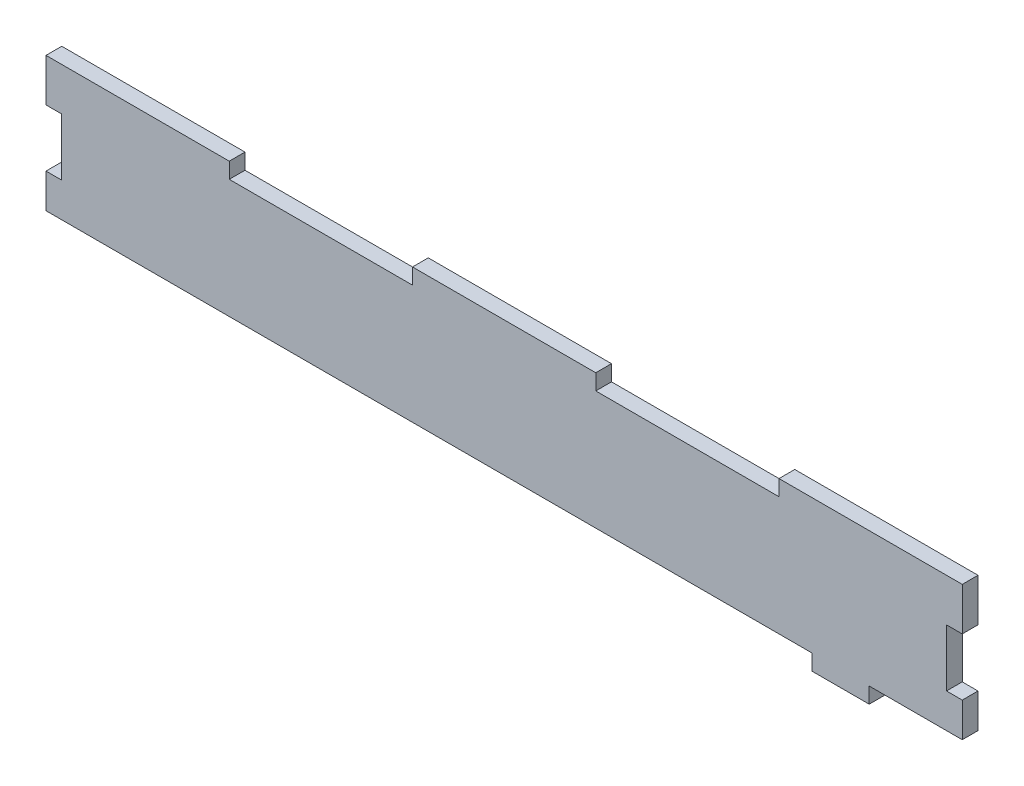
ISO-10303-21;
HEADER;
FILE_DESCRIPTION(('STEP AP214'),'2;1');
FILE_NAME('part.step','',(''),(''),'','','');
FILE_SCHEMA(('AUTOMOTIVE_DESIGN { 1 0 10303 214 1 1 1 1 }'));
ENDSEC;
DATA;
#1=APPLICATION_CONTEXT('core data for automotive mechanical design processes');
#2=APPLICATION_PROTOCOL_DEFINITION('international standard','automotive_design',2000,#1);
#3=PRODUCT_CONTEXT('',#1,'mechanical');
#4=PRODUCT('Part','Part','',(#3));
#5=PRODUCT_RELATED_PRODUCT_CATEGORY('part','',(#4));
#6=PRODUCT_DEFINITION_FORMATION('','',#4);
#7=PRODUCT_DEFINITION_CONTEXT('part definition',#1,'design');
#8=PRODUCT_DEFINITION('design','',#6,#7);
#9=PRODUCT_DEFINITION_SHAPE('','',#8);
#10=(LENGTH_UNIT() NAMED_UNIT(*) SI_UNIT(.MILLI.,.METRE.));
#11=(NAMED_UNIT(*) PLANE_ANGLE_UNIT() SI_UNIT($,.RADIAN.));
#12=(NAMED_UNIT(*) SI_UNIT($,.STERADIAN.) SOLID_ANGLE_UNIT());
#13=UNCERTAINTY_MEASURE_WITH_UNIT(LENGTH_MEASURE(1.E-05),#10,'distance_accuracy_value','');
#14=(GEOMETRIC_REPRESENTATION_CONTEXT(3) GLOBAL_UNCERTAINTY_ASSIGNED_CONTEXT((#13)) GLOBAL_UNIT_ASSIGNED_CONTEXT((#10,
#11,#12)) REPRESENTATION_CONTEXT('',''));
#15=CARTESIAN_POINT('',(0.,0.,0.));
#16=DIRECTION('',(0.,0.,1.));
#17=DIRECTION('',(1.,0.,0.));
#18=AXIS2_PLACEMENT_3D('',#15,#16,#17);
#19=CARTESIAN_POINT('',(203.723249151837,3.30834279228149,5.5));
#20=DIRECTION('',(0.,1.,0.));
#21=DIRECTION('',(-1.,0.,0.));
#22=AXIS2_PLACEMENT_3D('',#19,#20,#21);
#23=PLANE('',#22);
#24=DIRECTION('',(1.,0.,0.));
#25=VECTOR('',#24,1.);
#26=CARTESIAN_POINT('',(203.723249151837,3.30834279228149,0.));
#27=LINE('',#26,#25);
#28=CARTESIAN_POINT('',(-63.7767508481628,3.3083427922815,0.));
#29=VERTEX_POINT('',#28);
#30=CARTESIAN_POINT('',(203.723249151837,3.30834279228149,0.));
#31=VERTEX_POINT('',#30);
#32=EDGE_CURVE('E225',#29,#31,#27,.T.);
#33=ORIENTED_EDGE('',*,*,#32,.T.);
#34=DIRECTION('',(0.,0.,-1.));
#35=VECTOR('',#34,1.);
#36=CARTESIAN_POINT('',(203.723249151837,3.30834279228149,5.5));
#37=LINE('',#36,#35);
#38=CARTESIAN_POINT('',(203.723249151837,3.30834279228149,5.5));
#39=VERTEX_POINT('',#38);
#40=EDGE_CURVE('E11',#39,#31,#37,.T.);
#41=ORIENTED_EDGE('',*,*,#40,.F.);
#42=DIRECTION('',(1.,0.,0.));
#43=VECTOR('',#42,1.);
#44=CARTESIAN_POINT('',(203.723249151837,3.30834279228149,5.5));
#45=LINE('',#44,#43);
#46=CARTESIAN_POINT('',(-63.7767508481628,3.3083427922815,5.5));
#47=VERTEX_POINT('',#46);
#48=EDGE_CURVE('E271',#47,#39,#45,.T.);
#49=ORIENTED_EDGE('',*,*,#48,.F.);
#50=DIRECTION('',(0.,0.,-1.));
#51=VECTOR('',#50,1.);
#52=CARTESIAN_POINT('',(-63.7767508481628,3.3083427922815,5.5));
#53=LINE('',#52,#51);
#54=EDGE_CURVE('E221',#47,#29,#53,.T.);
#55=ORIENTED_EDGE('',*,*,#54,.T.);
#56=EDGE_LOOP('',(#33,#41,#49,#55));
#57=FACE_BOUND('',#56,.T.);
#58=ADVANCED_FACE('F33',(#57),#23,.F.);
#59=CARTESIAN_POINT('',(203.723249151837,-2.19165720771851,5.5));
#60=DIRECTION('',(1.,0.,0.));
#61=DIRECTION('',(0.,0.,-1.));
#62=AXIS2_PLACEMENT_3D('',#59,#60,#61);
#63=PLANE('',#62);
#64=DIRECTION('',(0.,-1.,0.));
#65=VECTOR('',#64,1.);
#66=CARTESIAN_POINT('',(203.723249151837,-2.19165720771851,0.));
#67=LINE('',#66,#65);
#68=CARTESIAN_POINT('',(203.723249151837,-2.19165720771851,0.));
#69=VERTEX_POINT('',#68);
#70=EDGE_CURVE('E228',#31,#69,#67,.T.);
#71=ORIENTED_EDGE('',*,*,#70,.T.);
#72=DIRECTION('',(0.,0.,-1.));
#73=VECTOR('',#72,1.);
#74=CARTESIAN_POINT('',(203.723249151837,-2.19165720771851,5.5));
#75=LINE('',#74,#73);
#76=CARTESIAN_POINT('',(203.723249151837,-2.19165720771851,5.5));
#77=VERTEX_POINT('',#76);
#78=EDGE_CURVE('E41',#77,#69,#75,.T.);
#79=ORIENTED_EDGE('',*,*,#78,.F.);
#80=DIRECTION('',(0.,-1.,0.));
#81=VECTOR('',#80,1.);
#82=CARTESIAN_POINT('',(203.723249151837,-2.19165720771851,5.5));
#83=LINE('',#82,#81);
#84=EDGE_CURVE('E140',#39,#77,#83,.T.);
#85=ORIENTED_EDGE('',*,*,#84,.F.);
#86=ORIENTED_EDGE('',*,*,#40,.T.);
#87=EDGE_LOOP('',(#71,#79,#85,#86));
#88=FACE_BOUND('',#87,.T.);
#89=ADVANCED_FACE('F409',(#88),#63,.F.);
#90=CARTESIAN_POINT('',(223.723249151837,-2.19165720771851,5.5));
#91=DIRECTION('',(0.,1.,0.));
#92=DIRECTION('',(-1.,0.,0.));
#93=AXIS2_PLACEMENT_3D('',#90,#91,#92);
#94=PLANE('',#93);
#95=DIRECTION('',(1.,0.,0.));
#96=VECTOR('',#95,1.);
#97=CARTESIAN_POINT('',(223.723249151837,-2.19165720771851,0.));
#98=LINE('',#97,#96);
#99=CARTESIAN_POINT('',(223.723249151837,-2.19165720771851,0.));
#100=VERTEX_POINT('',#99);
#101=EDGE_CURVE('E230',#69,#100,#98,.T.);
#102=ORIENTED_EDGE('',*,*,#101,.T.);
#103=DIRECTION('',(0.,0.,-1.));
#104=VECTOR('',#103,1.);
#105=CARTESIAN_POINT('',(223.723249151837,-2.19165720771851,5.5));
#106=LINE('',#105,#104);
#107=CARTESIAN_POINT('',(223.723249151837,-2.19165720771851,5.5));
#108=VERTEX_POINT('',#107);
#109=EDGE_CURVE('E326',#108,#100,#106,.T.);
#110=ORIENTED_EDGE('',*,*,#109,.F.);
#111=DIRECTION('',(1.,0.,0.));
#112=VECTOR('',#111,1.);
#113=CARTESIAN_POINT('',(223.723249151837,-2.19165720771851,5.5));
#114=LINE('',#113,#112);
#115=EDGE_CURVE('E334',#77,#108,#114,.T.);
#116=ORIENTED_EDGE('',*,*,#115,.F.);
#117=ORIENTED_EDGE('',*,*,#78,.T.);
#118=EDGE_LOOP('',(#102,#110,#116,#117));
#119=FACE_BOUND('',#118,.T.);
#120=ADVANCED_FACE('F332',(#119),#94,.F.);
#121=CARTESIAN_POINT('',(223.723249151837,3.30834279228149,5.5));
#122=DIRECTION('',(-1.,0.,0.));
#123=DIRECTION('',(0.,0.,1.));
#124=AXIS2_PLACEMENT_3D('',#121,#122,#123);
#125=PLANE('',#124);
#126=DIRECTION('',(0.,1.,0.));
#127=VECTOR('',#126,1.);
#128=CARTESIAN_POINT('',(223.723249151837,3.30834279228149,0.));
#129=LINE('',#128,#127);
#130=CARTESIAN_POINT('',(223.723249151837,3.30834279228149,0.));
#131=VERTEX_POINT('',#130);
#132=EDGE_CURVE('E232',#100,#131,#129,.T.);
#133=ORIENTED_EDGE('',*,*,#132,.T.);
#134=DIRECTION('',(0.,0.,-1.));
#135=VECTOR('',#134,1.);
#136=CARTESIAN_POINT('',(223.723249151837,3.30834279228149,5.5));
#137=LINE('',#136,#135);
#138=CARTESIAN_POINT('',(223.723249151837,3.30834279228149,5.5));
#139=VERTEX_POINT('',#138);
#140=EDGE_CURVE('E323',#139,#131,#137,.T.);
#141=ORIENTED_EDGE('',*,*,#140,.F.);
#142=DIRECTION('',(0.,1.,0.));
#143=VECTOR('',#142,1.);
#144=CARTESIAN_POINT('',(223.723249151837,3.30834279228149,5.5));
#145=LINE('',#144,#143);
#146=EDGE_CURVE('E352',#108,#139,#145,.T.);
#147=ORIENTED_EDGE('',*,*,#146,.F.);
#148=ORIENTED_EDGE('',*,*,#109,.T.);
#149=EDGE_LOOP('',(#133,#141,#147,#148));
#150=FACE_BOUND('',#149,.T.);
#151=ADVANCED_FACE('F343',(#150),#125,.F.);
#152=CARTESIAN_POINT('',(256.223249151837,3.3083427922815,5.5));
#153=DIRECTION('',(0.,1.,0.));
#154=DIRECTION('',(-1.,0.,0.));
#155=AXIS2_PLACEMENT_3D('',#152,#153,#154);
#156=PLANE('',#155);
#157=DIRECTION('',(1.,0.,0.));
#158=VECTOR('',#157,1.);
#159=CARTESIAN_POINT('',(256.223249151837,3.3083427922815,0.));
#160=LINE('',#159,#158);
#161=CARTESIAN_POINT('',(256.223249151837,3.3083427922815,0.));
#162=VERTEX_POINT('',#161);
#163=EDGE_CURVE('E234',#131,#162,#160,.T.);
#164=ORIENTED_EDGE('',*,*,#163,.T.);
#165=DIRECTION('',(0.,0.,-1.));
#166=VECTOR('',#165,1.);
#167=CARTESIAN_POINT('',(256.223249151837,3.3083427922815,5.5));
#168=LINE('',#167,#166);
#169=CARTESIAN_POINT('',(256.223249151837,3.3083427922815,5.5));
#170=VERTEX_POINT('',#169);
#171=EDGE_CURVE('E320',#170,#162,#168,.T.);
#172=ORIENTED_EDGE('',*,*,#171,.F.);
#173=DIRECTION('',(1.,0.,0.));
#174=VECTOR('',#173,1.);
#175=CARTESIAN_POINT('',(256.223249151837,3.3083427922815,5.5));
#176=LINE('',#175,#174);
#177=EDGE_CURVE('E349',#139,#170,#176,.T.);
#178=ORIENTED_EDGE('',*,*,#177,.F.);
#179=ORIENTED_EDGE('',*,*,#140,.T.);
#180=EDGE_LOOP('',(#164,#172,#178,#179));
#181=FACE_BOUND('',#180,.T.);
#182=ADVANCED_FACE('F347',(#181),#156,.F.);
#183=CARTESIAN_POINT('',(256.223249151837,15.3083427922815,5.5));
#184=DIRECTION('',(-1.,0.,0.));
#185=DIRECTION('',(0.,0.,1.));
#186=AXIS2_PLACEMENT_3D('',#183,#184,#185);
#187=PLANE('',#186);
#188=DIRECTION('',(0.,1.,0.));
#189=VECTOR('',#188,1.);
#190=CARTESIAN_POINT('',(256.223249151837,15.3083427922815,0.));
#191=LINE('',#190,#189);
#192=CARTESIAN_POINT('',(256.223249151837,15.3083427922815,0.));
#193=VERTEX_POINT('',#192);
#194=EDGE_CURVE('E236',#162,#193,#191,.T.);
#195=ORIENTED_EDGE('',*,*,#194,.T.);
#196=DIRECTION('',(0.,0.,-1.));
#197=VECTOR('',#196,1.);
#198=CARTESIAN_POINT('',(256.223249151837,15.3083427922815,5.5));
#199=LINE('',#198,#197);
#200=CARTESIAN_POINT('',(256.223249151837,15.3083427922815,5.5));
#201=VERTEX_POINT('',#200);
#202=EDGE_CURVE('E317',#201,#193,#199,.T.);
#203=ORIENTED_EDGE('',*,*,#202,.F.);
#204=DIRECTION('',(0.,1.,0.));
#205=VECTOR('',#204,1.);
#206=CARTESIAN_POINT('',(256.223249151837,15.3083427922815,5.5));
#207=LINE('',#206,#205);
#208=EDGE_CURVE('E351',#170,#201,#207,.T.);
#209=ORIENTED_EDGE('',*,*,#208,.F.);
#210=ORIENTED_EDGE('',*,*,#171,.T.);
#211=EDGE_LOOP('',(#195,#203,#209,#210));
#212=FACE_BOUND('',#211,.T.);
#213=ADVANCED_FACE('F422',(#212),#187,.F.);
#214=CARTESIAN_POINT('',(250.723249151837,15.3083427922815,5.5));
#215=DIRECTION('',(0.,-1.,0.));
#216=DIRECTION('',(0.,0.,-1.));
#217=AXIS2_PLACEMENT_3D('',#214,#215,#216);
#218=PLANE('',#217);
#219=DIRECTION('',(-1.,0.,0.));
#220=VECTOR('',#219,1.);
#221=CARTESIAN_POINT('',(250.723249151837,15.3083427922815,0.));
#222=LINE('',#221,#220);
#223=CARTESIAN_POINT('',(250.723249151837,15.3083427922815,0.));
#224=VERTEX_POINT('',#223);
#225=EDGE_CURVE('E238',#193,#224,#222,.T.);
#226=ORIENTED_EDGE('',*,*,#225,.T.);
#227=DIRECTION('',(0.,0.,-1.));
#228=VECTOR('',#227,1.);
#229=CARTESIAN_POINT('',(250.723249151837,15.3083427922815,5.5));
#230=LINE('',#229,#228);
#231=CARTESIAN_POINT('',(250.723249151837,15.3083427922815,5.5));
#232=VERTEX_POINT('',#231);
#233=EDGE_CURVE('E314',#232,#224,#230,.T.);
#234=ORIENTED_EDGE('',*,*,#233,.F.);
#235=DIRECTION('',(-1.,0.,0.));
#236=VECTOR('',#235,1.);
#237=CARTESIAN_POINT('',(250.723249151837,15.3083427922815,5.5));
#238=LINE('',#237,#236);
#239=EDGE_CURVE('E354',#201,#232,#238,.T.);
#240=ORIENTED_EDGE('',*,*,#239,.F.);
#241=ORIENTED_EDGE('',*,*,#202,.T.);
#242=EDGE_LOOP('',(#226,#234,#240,#241));
#243=FACE_BOUND('',#242,.T.);
#244=ADVANCED_FACE('F425',(#243),#218,.F.);
#245=CARTESIAN_POINT('',(250.723249151837,35.3083427922815,5.5));
#246=DIRECTION('',(-1.,0.,0.));
#247=DIRECTION('',(0.,0.,1.));
#248=AXIS2_PLACEMENT_3D('',#245,#246,#247);
#249=PLANE('',#248);
#250=DIRECTION('',(0.,1.,0.));
#251=VECTOR('',#250,1.);
#252=CARTESIAN_POINT('',(250.723249151837,35.3083427922815,0.));
#253=LINE('',#252,#251);
#254=CARTESIAN_POINT('',(250.723249151837,35.3083427922815,0.));
#255=VERTEX_POINT('',#254);
#256=EDGE_CURVE('E240',#224,#255,#253,.T.);
#257=ORIENTED_EDGE('',*,*,#256,.T.);
#258=DIRECTION('',(0.,0.,-1.));
#259=VECTOR('',#258,1.);
#260=CARTESIAN_POINT('',(250.723249151837,35.3083427922815,5.5));
#261=LINE('',#260,#259);
#262=CARTESIAN_POINT('',(250.723249151837,35.3083427922815,5.5));
#263=VERTEX_POINT('',#262);
#264=EDGE_CURVE('E311',#263,#255,#261,.T.);
#265=ORIENTED_EDGE('',*,*,#264,.F.);
#266=DIRECTION('',(0.,1.,0.));
#267=VECTOR('',#266,1.);
#268=CARTESIAN_POINT('',(250.723249151837,35.3083427922815,5.5));
#269=LINE('',#268,#267);
#270=EDGE_CURVE('E360',#232,#263,#269,.T.);
#271=ORIENTED_EDGE('',*,*,#270,.F.);
#272=ORIENTED_EDGE('',*,*,#233,.T.);
#273=EDGE_LOOP('',(#257,#265,#271,#272));
#274=FACE_BOUND('',#273,.T.);
#275=ADVANCED_FACE('F429',(#274),#249,.F.);
#276=CARTESIAN_POINT('',(256.223249151837,35.3083427922815,5.5));
#277=DIRECTION('',(0.,1.,0.));
#278=DIRECTION('',(0.,0.,1.));
#279=AXIS2_PLACEMENT_3D('',#276,#277,#278);
#280=PLANE('',#279);
#281=DIRECTION('',(1.,0.,0.));
#282=VECTOR('',#281,1.);
#283=CARTESIAN_POINT('',(256.223249151837,35.3083427922815,0.));
#284=LINE('',#283,#282);
#285=CARTESIAN_POINT('',(256.223249151837,35.3083427922815,0.));
#286=VERTEX_POINT('',#285);
#287=EDGE_CURVE('E242',#255,#286,#284,.T.);
#288=ORIENTED_EDGE('',*,*,#287,.T.);
#289=DIRECTION('',(0.,0.,-1.));
#290=VECTOR('',#289,1.);
#291=CARTESIAN_POINT('',(256.223249151837,35.3083427922815,5.5));
#292=LINE('',#291,#290);
#293=CARTESIAN_POINT('',(256.223249151837,35.3083427922815,5.5));
#294=VERTEX_POINT('',#293);
#295=EDGE_CURVE('E308',#294,#286,#292,.T.);
#296=ORIENTED_EDGE('',*,*,#295,.F.);
#297=DIRECTION('',(1.,0.,0.));
#298=VECTOR('',#297,1.);
#299=CARTESIAN_POINT('',(256.223249151837,35.3083427922815,5.5));
#300=LINE('',#299,#298);
#301=EDGE_CURVE('E362',#263,#294,#300,.T.);
#302=ORIENTED_EDGE('',*,*,#301,.F.);
#303=ORIENTED_EDGE('',*,*,#264,.T.);
#304=EDGE_LOOP('',(#288,#296,#302,#303));
#305=FACE_BOUND('',#304,.T.);
#306=ADVANCED_FACE('F433',(#305),#280,.F.);
#307=CARTESIAN_POINT('',(256.223249151837,50.3083427922815,5.5));
#308=DIRECTION('',(-1.,0.,0.));
#309=DIRECTION('',(0.,0.,1.));
#310=AXIS2_PLACEMENT_3D('',#307,#308,#309);
#311=PLANE('',#310);
#312=DIRECTION('',(0.,1.,0.));
#313=VECTOR('',#312,1.);
#314=CARTESIAN_POINT('',(256.223249151837,50.3083427922815,0.));
#315=LINE('',#314,#313);
#316=CARTESIAN_POINT('',(256.223249151837,50.3083427922815,0.));
#317=VERTEX_POINT('',#316);
#318=EDGE_CURVE('E244',#286,#317,#315,.T.);
#319=ORIENTED_EDGE('',*,*,#318,.T.);
#320=DIRECTION('',(0.,0.,-1.));
#321=VECTOR('',#320,1.);
#322=CARTESIAN_POINT('',(256.223249151837,50.3083427922815,5.5));
#323=LINE('',#322,#321);
#324=CARTESIAN_POINT('',(256.223249151837,50.3083427922815,5.5));
#325=VERTEX_POINT('',#324);
#326=EDGE_CURVE('E305',#325,#317,#323,.T.);
#327=ORIENTED_EDGE('',*,*,#326,.F.);
#328=DIRECTION('',(0.,1.,0.));
#329=VECTOR('',#328,1.);
#330=CARTESIAN_POINT('',(256.223249151837,50.3083427922815,5.5));
#331=LINE('',#330,#329);
#332=EDGE_CURVE('E364',#294,#325,#331,.T.);
#333=ORIENTED_EDGE('',*,*,#332,.F.);
#334=ORIENTED_EDGE('',*,*,#295,.T.);
#335=EDGE_LOOP('',(#319,#327,#333,#334));
#336=FACE_BOUND('',#335,.T.);
#337=ADVANCED_FACE('F437',(#336),#311,.F.);
#338=CARTESIAN_POINT('',(192.223249151837,50.3083427922815,5.5));
#339=DIRECTION('',(0.,-1.,0.));
#340=DIRECTION('',(0.,0.,-1.));
#341=AXIS2_PLACEMENT_3D('',#338,#339,#340);
#342=PLANE('',#341);
#343=DIRECTION('',(-1.,0.,0.));
#344=VECTOR('',#343,1.);
#345=CARTESIAN_POINT('',(192.223249151837,50.3083427922815,0.));
#346=LINE('',#345,#344);
#347=CARTESIAN_POINT('',(192.223249151837,50.3083427922815,0.));
#348=VERTEX_POINT('',#347);
#349=EDGE_CURVE('E246',#317,#348,#346,.T.);
#350=ORIENTED_EDGE('',*,*,#349,.T.);
#351=DIRECTION('',(0.,0.,-1.));
#352=VECTOR('',#351,1.);
#353=CARTESIAN_POINT('',(192.223249151837,50.3083427922815,5.5));
#354=LINE('',#353,#352);
#355=CARTESIAN_POINT('',(192.223249151837,50.3083427922815,5.5));
#356=VERTEX_POINT('',#355);
#357=EDGE_CURVE('E302',#356,#348,#354,.T.);
#358=ORIENTED_EDGE('',*,*,#357,.F.);
#359=DIRECTION('',(-1.,0.,0.));
#360=VECTOR('',#359,1.);
#361=CARTESIAN_POINT('',(192.223249151837,50.3083427922815,5.5));
#362=LINE('',#361,#360);
#363=EDGE_CURVE('E366',#325,#356,#362,.T.);
#364=ORIENTED_EDGE('',*,*,#363,.F.);
#365=ORIENTED_EDGE('',*,*,#326,.T.);
#366=EDGE_LOOP('',(#350,#358,#364,#365));
#367=FACE_BOUND('',#366,.T.);
#368=ADVANCED_FACE('F441',(#367),#342,.F.);
#369=CARTESIAN_POINT('',(192.223249151837,44.8083427922815,5.5));
#370=DIRECTION('',(1.,0.,0.));
#371=DIRECTION('',(0.,0.,-1.));
#372=AXIS2_PLACEMENT_3D('',#369,#370,#371);
#373=PLANE('',#372);
#374=DIRECTION('',(0.,-1.,0.));
#375=VECTOR('',#374,1.);
#376=CARTESIAN_POINT('',(192.223249151837,44.8083427922815,0.));
#377=LINE('',#376,#375);
#378=CARTESIAN_POINT('',(192.223249151837,44.8083427922815,0.));
#379=VERTEX_POINT('',#378);
#380=EDGE_CURVE('E248',#348,#379,#377,.T.);
#381=ORIENTED_EDGE('',*,*,#380,.T.);
#382=DIRECTION('',(0.,0.,-1.));
#383=VECTOR('',#382,1.);
#384=CARTESIAN_POINT('',(192.223249151837,44.8083427922815,5.5));
#385=LINE('',#384,#383);
#386=CARTESIAN_POINT('',(192.223249151837,44.8083427922815,5.5));
#387=VERTEX_POINT('',#386);
#388=EDGE_CURVE('E299',#387,#379,#385,.T.);
#389=ORIENTED_EDGE('',*,*,#388,.F.);
#390=DIRECTION('',(0.,-1.,0.));
#391=VECTOR('',#390,1.);
#392=CARTESIAN_POINT('',(192.223249151837,44.8083427922815,5.5));
#393=LINE('',#392,#391);
#394=EDGE_CURVE('E368',#356,#387,#393,.T.);
#395=ORIENTED_EDGE('',*,*,#394,.F.);
#396=ORIENTED_EDGE('',*,*,#357,.T.);
#397=EDGE_LOOP('',(#381,#389,#395,#396));
#398=FACE_BOUND('',#397,.T.);
#399=ADVANCED_FACE('F445',(#398),#373,.F.);
#400=CARTESIAN_POINT('',(128.223249151837,44.8083427922815,5.5));
#401=DIRECTION('',(0.,-1.,0.));
#402=DIRECTION('',(0.,0.,-1.));
#403=AXIS2_PLACEMENT_3D('',#400,#401,#402);
#404=PLANE('',#403);
#405=DIRECTION('',(-1.,0.,0.));
#406=VECTOR('',#405,1.);
#407=CARTESIAN_POINT('',(128.223249151837,44.8083427922815,0.));
#408=LINE('',#407,#406);
#409=CARTESIAN_POINT('',(128.223249151837,44.8083427922815,0.));
#410=VERTEX_POINT('',#409);
#411=EDGE_CURVE('E250',#379,#410,#408,.T.);
#412=ORIENTED_EDGE('',*,*,#411,.T.);
#413=DIRECTION('',(0.,0.,-1.));
#414=VECTOR('',#413,1.);
#415=CARTESIAN_POINT('',(128.223249151837,44.8083427922815,5.5));
#416=LINE('',#415,#414);
#417=CARTESIAN_POINT('',(128.223249151837,44.8083427922815,5.5));
#418=VERTEX_POINT('',#417);
#419=EDGE_CURVE('E296',#418,#410,#416,.T.);
#420=ORIENTED_EDGE('',*,*,#419,.F.);
#421=DIRECTION('',(-1.,0.,0.));
#422=VECTOR('',#421,1.);
#423=CARTESIAN_POINT('',(128.223249151837,44.8083427922815,5.5));
#424=LINE('',#423,#422);
#425=EDGE_CURVE('E370',#387,#418,#424,.T.);
#426=ORIENTED_EDGE('',*,*,#425,.F.);
#427=ORIENTED_EDGE('',*,*,#388,.T.);
#428=EDGE_LOOP('',(#412,#420,#426,#427));
#429=FACE_BOUND('',#428,.T.);
#430=ADVANCED_FACE('F449',(#429),#404,.F.);
#431=CARTESIAN_POINT('',(128.223249151837,50.3083427922815,5.5));
#432=DIRECTION('',(-1.,0.,0.));
#433=DIRECTION('',(0.,0.,1.));
#434=AXIS2_PLACEMENT_3D('',#431,#432,#433);
#435=PLANE('',#434);
#436=DIRECTION('',(0.,1.,0.));
#437=VECTOR('',#436,1.);
#438=CARTESIAN_POINT('',(128.223249151837,50.3083427922815,0.));
#439=LINE('',#438,#437);
#440=CARTESIAN_POINT('',(128.223249151837,50.3083427922815,0.));
#441=VERTEX_POINT('',#440);
#442=EDGE_CURVE('E252',#410,#441,#439,.T.);
#443=ORIENTED_EDGE('',*,*,#442,.T.);
#444=DIRECTION('',(0.,0.,-1.));
#445=VECTOR('',#444,1.);
#446=CARTESIAN_POINT('',(128.223249151837,50.3083427922815,5.5));
#447=LINE('',#446,#445);
#448=CARTESIAN_POINT('',(128.223249151837,50.3083427922815,5.5));
#449=VERTEX_POINT('',#448);
#450=EDGE_CURVE('E293',#449,#441,#447,.T.);
#451=ORIENTED_EDGE('',*,*,#450,.F.);
#452=DIRECTION('',(0.,1.,0.));
#453=VECTOR('',#452,1.);
#454=CARTESIAN_POINT('',(128.223249151837,50.3083427922815,5.5));
#455=LINE('',#454,#453);
#456=EDGE_CURVE('E372',#418,#449,#455,.T.);
#457=ORIENTED_EDGE('',*,*,#456,.F.);
#458=ORIENTED_EDGE('',*,*,#419,.T.);
#459=EDGE_LOOP('',(#443,#451,#457,#458));
#460=FACE_BOUND('',#459,.T.);
#461=ADVANCED_FACE('F453',(#460),#435,.F.);
#462=CARTESIAN_POINT('',(64.2232491518372,50.3083427922815,5.5));
#463=DIRECTION('',(0.,-1.,0.));
#464=DIRECTION('',(0.,0.,-1.));
#465=AXIS2_PLACEMENT_3D('',#462,#463,#464);
#466=PLANE('',#465);
#467=DIRECTION('',(-1.,0.,0.));
#468=VECTOR('',#467,1.);
#469=CARTESIAN_POINT('',(64.2232491518372,50.3083427922815,0.));
#470=LINE('',#469,#468);
#471=CARTESIAN_POINT('',(64.2232491518372,50.3083427922815,0.));
#472=VERTEX_POINT('',#471);
#473=EDGE_CURVE('E254',#441,#472,#470,.T.);
#474=ORIENTED_EDGE('',*,*,#473,.T.);
#475=DIRECTION('',(0.,0.,-1.));
#476=VECTOR('',#475,1.);
#477=CARTESIAN_POINT('',(64.2232491518372,50.3083427922815,5.5));
#478=LINE('',#477,#476);
#479=CARTESIAN_POINT('',(64.2232491518372,50.3083427922815,5.5));
#480=VERTEX_POINT('',#479);
#481=EDGE_CURVE('E290',#480,#472,#478,.T.);
#482=ORIENTED_EDGE('',*,*,#481,.F.);
#483=DIRECTION('',(-1.,0.,0.));
#484=VECTOR('',#483,1.);
#485=CARTESIAN_POINT('',(64.2232491518372,50.3083427922815,5.5));
#486=LINE('',#485,#484);
#487=EDGE_CURVE('E374',#449,#480,#486,.T.);
#488=ORIENTED_EDGE('',*,*,#487,.F.);
#489=ORIENTED_EDGE('',*,*,#450,.T.);
#490=EDGE_LOOP('',(#474,#482,#488,#489));
#491=FACE_BOUND('',#490,.T.);
#492=ADVANCED_FACE('F457',(#491),#466,.F.);
#493=CARTESIAN_POINT('',(64.2232491518372,44.8083427922815,5.5));
#494=DIRECTION('',(1.,0.,0.));
#495=DIRECTION('',(0.,0.,-1.));
#496=AXIS2_PLACEMENT_3D('',#493,#494,#495);
#497=PLANE('',#496);
#498=DIRECTION('',(0.,-1.,0.));
#499=VECTOR('',#498,1.);
#500=CARTESIAN_POINT('',(64.2232491518372,44.8083427922815,0.));
#501=LINE('',#500,#499);
#502=CARTESIAN_POINT('',(64.2232491518372,44.8083427922815,0.));
#503=VERTEX_POINT('',#502);
#504=EDGE_CURVE('E256',#472,#503,#501,.T.);
#505=ORIENTED_EDGE('',*,*,#504,.T.);
#506=DIRECTION('',(0.,0.,-1.));
#507=VECTOR('',#506,1.);
#508=CARTESIAN_POINT('',(64.2232491518372,44.8083427922815,5.5));
#509=LINE('',#508,#507);
#510=CARTESIAN_POINT('',(64.2232491518372,44.8083427922815,5.5));
#511=VERTEX_POINT('',#510);
#512=EDGE_CURVE('E287',#511,#503,#509,.T.);
#513=ORIENTED_EDGE('',*,*,#512,.F.);
#514=DIRECTION('',(0.,-1.,0.));
#515=VECTOR('',#514,1.);
#516=CARTESIAN_POINT('',(64.2232491518372,44.8083427922815,5.5));
#517=LINE('',#516,#515);
#518=EDGE_CURVE('E376',#480,#511,#517,.T.);
#519=ORIENTED_EDGE('',*,*,#518,.F.);
#520=ORIENTED_EDGE('',*,*,#481,.T.);
#521=EDGE_LOOP('',(#505,#513,#519,#520));
#522=FACE_BOUND('',#521,.T.);
#523=ADVANCED_FACE('F461',(#522),#497,.F.);
#524=CARTESIAN_POINT('',(0.223249151837219,44.8083427922815,5.5));
#525=DIRECTION('',(0.,-1.,0.));
#526=DIRECTION('',(0.,0.,-1.));
#527=AXIS2_PLACEMENT_3D('',#524,#525,#526);
#528=PLANE('',#527);
#529=DIRECTION('',(-1.,0.,0.));
#530=VECTOR('',#529,1.);
#531=CARTESIAN_POINT('',(0.223249151837219,44.8083427922815,0.));
#532=LINE('',#531,#530);
#533=CARTESIAN_POINT('',(0.223249151837219,44.8083427922815,0.));
#534=VERTEX_POINT('',#533);
#535=EDGE_CURVE('E258',#503,#534,#532,.T.);
#536=ORIENTED_EDGE('',*,*,#535,.T.);
#537=DIRECTION('',(0.,0.,-1.));
#538=VECTOR('',#537,1.);
#539=CARTESIAN_POINT('',(0.223249151837219,44.8083427922815,5.5));
#540=LINE('',#539,#538);
#541=CARTESIAN_POINT('',(0.223249151837219,44.8083427922815,5.5));
#542=VERTEX_POINT('',#541);
#543=EDGE_CURVE('E284',#542,#534,#540,.T.);
#544=ORIENTED_EDGE('',*,*,#543,.F.);
#545=DIRECTION('',(-1.,0.,0.));
#546=VECTOR('',#545,1.);
#547=CARTESIAN_POINT('',(0.223249151837219,44.8083427922815,5.5));
#548=LINE('',#547,#546);
#549=EDGE_CURVE('E378',#511,#542,#548,.T.);
#550=ORIENTED_EDGE('',*,*,#549,.F.);
#551=ORIENTED_EDGE('',*,*,#512,.T.);
#552=EDGE_LOOP('',(#536,#544,#550,#551));
#553=FACE_BOUND('',#552,.T.);
#554=ADVANCED_FACE('F465',(#553),#528,.F.);
#555=CARTESIAN_POINT('',(0.223249151837218,50.3083427922815,5.5));
#556=DIRECTION('',(-1.,0.,0.));
#557=DIRECTION('',(0.,-1.,0.));
#558=AXIS2_PLACEMENT_3D('',#555,#556,#557);
#559=PLANE('',#558);
#560=DIRECTION('',(0.,1.,0.));
#561=VECTOR('',#560,1.);
#562=CARTESIAN_POINT('',(0.223249151837218,50.3083427922815,0.));
#563=LINE('',#562,#561);
#564=CARTESIAN_POINT('',(0.223249151837218,50.3083427922815,0.));
#565=VERTEX_POINT('',#564);
#566=EDGE_CURVE('E260',#534,#565,#563,.T.);
#567=ORIENTED_EDGE('',*,*,#566,.T.);
#568=DIRECTION('',(0.,0.,-1.));
#569=VECTOR('',#568,1.);
#570=CARTESIAN_POINT('',(0.223249151837218,50.3083427922815,5.5));
#571=LINE('',#570,#569);
#572=CARTESIAN_POINT('',(0.223249151837218,50.3083427922815,5.5));
#573=VERTEX_POINT('',#572);
#574=EDGE_CURVE('E281',#573,#565,#571,.T.);
#575=ORIENTED_EDGE('',*,*,#574,.F.);
#576=DIRECTION('',(0.,1.,0.));
#577=VECTOR('',#576,1.);
#578=CARTESIAN_POINT('',(0.223249151837218,50.3083427922815,5.5));
#579=LINE('',#578,#577);
#580=EDGE_CURVE('E380',#542,#573,#579,.T.);
#581=ORIENTED_EDGE('',*,*,#580,.F.);
#582=ORIENTED_EDGE('',*,*,#543,.T.);
#583=EDGE_LOOP('',(#567,#575,#581,#582));
#584=FACE_BOUND('',#583,.T.);
#585=ADVANCED_FACE('F469',(#584),#559,.F.);
#586=CARTESIAN_POINT('',(-63.7767508481628,50.3083427922815,5.5));
#587=DIRECTION('',(0.,-1.,0.));
#588=DIRECTION('',(0.,0.,-1.));
#589=AXIS2_PLACEMENT_3D('',#586,#587,#588);
#590=PLANE('',#589);
#591=DIRECTION('',(-1.,0.,0.));
#592=VECTOR('',#591,1.);
#593=CARTESIAN_POINT('',(-63.7767508481628,50.3083427922815,0.));
#594=LINE('',#593,#592);
#595=CARTESIAN_POINT('',(-63.7767508481628,50.3083427922815,0.));
#596=VERTEX_POINT('',#595);
#597=EDGE_CURVE('E262',#565,#596,#594,.T.);
#598=ORIENTED_EDGE('',*,*,#597,.T.);
#599=DIRECTION('',(0.,0.,-1.));
#600=VECTOR('',#599,1.);
#601=CARTESIAN_POINT('',(-63.7767508481628,50.3083427922815,5.5));
#602=LINE('',#601,#600);
#603=CARTESIAN_POINT('',(-63.7767508481628,50.3083427922815,5.5));
#604=VERTEX_POINT('',#603);
#605=EDGE_CURVE('E278',#604,#596,#602,.T.);
#606=ORIENTED_EDGE('',*,*,#605,.F.);
#607=DIRECTION('',(-1.,0.,0.));
#608=VECTOR('',#607,1.);
#609=CARTESIAN_POINT('',(-63.7767508481628,50.3083427922815,5.5));
#610=LINE('',#609,#608);
#611=EDGE_CURVE('E382',#573,#604,#610,.T.);
#612=ORIENTED_EDGE('',*,*,#611,.F.);
#613=ORIENTED_EDGE('',*,*,#574,.T.);
#614=EDGE_LOOP('',(#598,#606,#612,#613));
#615=FACE_BOUND('',#614,.T.);
#616=ADVANCED_FACE('F473',(#615),#590,.F.);
#617=CARTESIAN_POINT('',(-63.7767508481628,35.3083427922815,5.5));
#618=DIRECTION('',(1.,0.,0.));
#619=DIRECTION('',(0.,0.,-1.));
#620=AXIS2_PLACEMENT_3D('',#617,#618,#619);
#621=PLANE('',#620);
#622=DIRECTION('',(0.,-1.,0.));
#623=VECTOR('',#622,1.);
#624=CARTESIAN_POINT('',(-63.7767508481628,35.3083427922815,0.));
#625=LINE('',#624,#623);
#626=CARTESIAN_POINT('',(-63.7767508481628,35.3083427922815,0.));
#627=VERTEX_POINT('',#626);
#628=EDGE_CURVE('E264',#596,#627,#625,.T.);
#629=ORIENTED_EDGE('',*,*,#628,.T.);
#630=DIRECTION('',(0.,0.,-1.));
#631=VECTOR('',#630,1.);
#632=CARTESIAN_POINT('',(-63.7767508481628,35.3083427922815,5.5));
#633=LINE('',#632,#631);
#634=CARTESIAN_POINT('',(-63.7767508481628,35.3083427922815,5.5));
#635=VERTEX_POINT('',#634);
#636=EDGE_CURVE('E275',#635,#627,#633,.T.);
#637=ORIENTED_EDGE('',*,*,#636,.F.);
#638=DIRECTION('',(0.,-1.,0.));
#639=VECTOR('',#638,1.);
#640=CARTESIAN_POINT('',(-63.7767508481628,35.3083427922815,5.5));
#641=LINE('',#640,#639);
#642=EDGE_CURVE('E384',#604,#635,#641,.T.);
#643=ORIENTED_EDGE('',*,*,#642,.F.);
#644=ORIENTED_EDGE('',*,*,#605,.T.);
#645=EDGE_LOOP('',(#629,#637,#643,#644));
#646=FACE_BOUND('',#645,.T.);
#647=ADVANCED_FACE('F390',(#646),#621,.F.);
#648=CARTESIAN_POINT('',(-58.2767508481628,35.3083427922815,5.5));
#649=DIRECTION('',(0.,1.,0.));
#650=DIRECTION('',(0.,0.,1.));
#651=AXIS2_PLACEMENT_3D('',#648,#649,#650);
#652=PLANE('',#651);
#653=DIRECTION('',(1.,0.,0.));
#654=VECTOR('',#653,1.);
#655=CARTESIAN_POINT('',(-58.2767508481628,35.3083427922815,0.));
#656=LINE('',#655,#654);
#657=CARTESIAN_POINT('',(-58.2767508481628,35.3083427922815,0.));
#658=VERTEX_POINT('',#657);
#659=EDGE_CURVE('E266',#627,#658,#656,.T.);
#660=ORIENTED_EDGE('',*,*,#659,.T.);
#661=DIRECTION('',(0.,0.,-1.));
#662=VECTOR('',#661,1.);
#663=CARTESIAN_POINT('',(-58.2767508481628,35.3083427922815,5.5));
#664=LINE('',#663,#662);
#665=CARTESIAN_POINT('',(-58.2767508481628,35.3083427922815,5.5));
#666=VERTEX_POINT('',#665);
#667=EDGE_CURVE('E216',#666,#658,#664,.T.);
#668=ORIENTED_EDGE('',*,*,#667,.F.);
#669=DIRECTION('',(1.,0.,0.));
#670=VECTOR('',#669,1.);
#671=CARTESIAN_POINT('',(-58.2767508481628,35.3083427922815,5.5));
#672=LINE('',#671,#670);
#673=EDGE_CURVE('E207',#635,#666,#672,.T.);
#674=ORIENTED_EDGE('',*,*,#673,.F.);
#675=ORIENTED_EDGE('',*,*,#636,.T.);
#676=EDGE_LOOP('',(#660,#668,#674,#675));
#677=FACE_BOUND('',#676,.T.);
#678=ADVANCED_FACE('F394',(#677),#652,.F.);
#679=CARTESIAN_POINT('',(-58.2767508481628,15.3083427922815,5.5));
#680=DIRECTION('',(1.,0.,0.));
#681=DIRECTION('',(0.,0.,-1.));
#682=AXIS2_PLACEMENT_3D('',#679,#680,#681);
#683=PLANE('',#682);
#684=DIRECTION('',(0.,-1.,0.));
#685=VECTOR('',#684,1.);
#686=CARTESIAN_POINT('',(-58.2767508481628,15.3083427922815,0.));
#687=LINE('',#686,#685);
#688=CARTESIAN_POINT('',(-58.2767508481628,15.3083427922815,0.));
#689=VERTEX_POINT('',#688);
#690=EDGE_CURVE('E215',#658,#689,#687,.T.);
#691=ORIENTED_EDGE('',*,*,#690,.T.);
#692=DIRECTION('',(0.,0.,-1.));
#693=VECTOR('',#692,1.);
#694=CARTESIAN_POINT('',(-58.2767508481628,15.3083427922815,5.5));
#695=LINE('',#694,#693);
#696=CARTESIAN_POINT('',(-58.2767508481628,15.3083427922815,5.5));
#697=VERTEX_POINT('',#696);
#698=EDGE_CURVE('E212',#697,#689,#695,.T.);
#699=ORIENTED_EDGE('',*,*,#698,.F.);
#700=DIRECTION('',(0.,-1.,0.));
#701=VECTOR('',#700,1.);
#702=CARTESIAN_POINT('',(-58.2767508481628,15.3083427922815,5.5));
#703=LINE('',#702,#701);
#704=EDGE_CURVE('E201',#666,#697,#703,.T.);
#705=ORIENTED_EDGE('',*,*,#704,.F.);
#706=ORIENTED_EDGE('',*,*,#667,.T.);
#707=EDGE_LOOP('',(#691,#699,#705,#706));
#708=FACE_BOUND('',#707,.T.);
#709=ADVANCED_FACE('F213',(#708),#683,.F.);
#710=CARTESIAN_POINT('',(-63.7767508481628,15.3083427922815,5.5));
#711=DIRECTION('',(0.,-1.,0.));
#712=DIRECTION('',(0.,0.,-1.));
#713=AXIS2_PLACEMENT_3D('',#710,#711,#712);
#714=PLANE('',#713);
#715=DIRECTION('',(-1.,0.,0.));
#716=VECTOR('',#715,1.);
#717=CARTESIAN_POINT('',(-63.7767508481628,15.3083427922815,0.));
#718=LINE('',#717,#716);
#719=CARTESIAN_POINT('',(-63.7767508481628,15.3083427922815,0.));
#720=VERTEX_POINT('',#719);
#721=EDGE_CURVE('E126',#689,#720,#718,.T.);
#722=ORIENTED_EDGE('',*,*,#721,.T.);
#723=DIRECTION('',(0.,0.,-1.));
#724=VECTOR('',#723,1.);
#725=CARTESIAN_POINT('',(-63.7767508481628,15.3083427922815,5.5));
#726=LINE('',#725,#724);
#727=CARTESIAN_POINT('',(-63.7767508481628,15.3083427922815,5.5));
#728=VERTEX_POINT('',#727);
#729=EDGE_CURVE('E217',#728,#720,#726,.T.);
#730=ORIENTED_EDGE('',*,*,#729,.F.);
#731=DIRECTION('',(-1.,0.,0.));
#732=VECTOR('',#731,1.);
#733=CARTESIAN_POINT('',(-63.7767508481628,15.3083427922815,5.5));
#734=LINE('',#733,#732);
#735=EDGE_CURVE('E205',#697,#728,#734,.T.);
#736=ORIENTED_EDGE('',*,*,#735,.F.);
#737=ORIENTED_EDGE('',*,*,#698,.T.);
#738=EDGE_LOOP('',(#722,#730,#736,#737));
#739=FACE_BOUND('',#738,.T.);
#740=ADVANCED_FACE('F219',(#739),#714,.F.);
#741=CARTESIAN_POINT('',(-63.7767508481628,3.3083427922815,5.5));
#742=DIRECTION('',(1.,0.,0.));
#743=DIRECTION('',(0.,0.,-1.));
#744=AXIS2_PLACEMENT_3D('',#741,#742,#743);
#745=PLANE('',#744);
#746=DIRECTION('',(0.,-1.,0.));
#747=VECTOR('',#746,1.);
#748=CARTESIAN_POINT('',(-63.7767508481628,3.3083427922815,0.));
#749=LINE('',#748,#747);
#750=EDGE_CURVE('E132',#720,#29,#749,.T.);
#751=ORIENTED_EDGE('',*,*,#750,.T.);
#752=ORIENTED_EDGE('',*,*,#54,.F.);
#753=DIRECTION('',(0.,-1.,0.));
#754=VECTOR('',#753,1.);
#755=CARTESIAN_POINT('',(-63.7767508481628,3.3083427922815,5.5));
#756=LINE('',#755,#754);
#757=EDGE_CURVE('E49',#728,#47,#756,.T.);
#758=ORIENTED_EDGE('',*,*,#757,.F.);
#759=ORIENTED_EDGE('',*,*,#729,.T.);
#760=EDGE_LOOP('',(#751,#752,#758,#759));
#761=FACE_BOUND('',#760,.T.);
#762=ADVANCED_FACE('F398',(#761),#745,.F.);
#763=CARTESIAN_POINT('',(0.,0.,5.5));
#764=DIRECTION('',(0.,0.,-1.));
#765=DIRECTION('',(-1.,0.,0.));
#766=AXIS2_PLACEMENT_3D('',#763,#764,#765);
#767=PLANE('',#766);
#768=ORIENTED_EDGE('',*,*,#48,.T.);
#769=ORIENTED_EDGE('',*,*,#84,.T.);
#770=ORIENTED_EDGE('',*,*,#115,.T.);
#771=ORIENTED_EDGE('',*,*,#146,.T.);
#772=ORIENTED_EDGE('',*,*,#177,.T.);
#773=ORIENTED_EDGE('',*,*,#208,.T.);
#774=ORIENTED_EDGE('',*,*,#239,.T.);
#775=ORIENTED_EDGE('',*,*,#270,.T.);
#776=ORIENTED_EDGE('',*,*,#301,.T.);
#777=ORIENTED_EDGE('',*,*,#332,.T.);
#778=ORIENTED_EDGE('',*,*,#363,.T.);
#779=ORIENTED_EDGE('',*,*,#394,.T.);
#780=ORIENTED_EDGE('',*,*,#425,.T.);
#781=ORIENTED_EDGE('',*,*,#456,.T.);
#782=ORIENTED_EDGE('',*,*,#487,.T.);
#783=ORIENTED_EDGE('',*,*,#518,.T.);
#784=ORIENTED_EDGE('',*,*,#549,.T.);
#785=ORIENTED_EDGE('',*,*,#580,.T.);
#786=ORIENTED_EDGE('',*,*,#611,.T.);
#787=ORIENTED_EDGE('',*,*,#642,.T.);
#788=ORIENTED_EDGE('',*,*,#673,.T.);
#789=ORIENTED_EDGE('',*,*,#704,.T.);
#790=ORIENTED_EDGE('',*,*,#735,.T.);
#791=ORIENTED_EDGE('',*,*,#757,.T.);
#792=EDGE_LOOP('',(#768,#769,#770,#771,#772,#773,#774,#775,#776,#777,#778,#779,#780,#781,#782,
#783,#784,#785,#786,#787,#788,#789,#790,#791));
#793=FACE_BOUND('',#792,.T.);
#794=ADVANCED_FACE('F203',(#793),#767,.F.);
#795=CARTESIAN_POINT('',(0.,0.,0.));
#796=DIRECTION('',(0.,0.,-1.));
#797=DIRECTION('',(-1.,0.,0.));
#798=AXIS2_PLACEMENT_3D('',#795,#796,#797);
#799=PLANE('',#798);
#800=ORIENTED_EDGE('',*,*,#32,.F.);
#801=ORIENTED_EDGE('',*,*,#750,.F.);
#802=ORIENTED_EDGE('',*,*,#721,.F.);
#803=ORIENTED_EDGE('',*,*,#690,.F.);
#804=ORIENTED_EDGE('',*,*,#659,.F.);
#805=ORIENTED_EDGE('',*,*,#628,.F.);
#806=ORIENTED_EDGE('',*,*,#597,.F.);
#807=ORIENTED_EDGE('',*,*,#566,.F.);
#808=ORIENTED_EDGE('',*,*,#535,.F.);
#809=ORIENTED_EDGE('',*,*,#504,.F.);
#810=ORIENTED_EDGE('',*,*,#473,.F.);
#811=ORIENTED_EDGE('',*,*,#442,.F.);
#812=ORIENTED_EDGE('',*,*,#411,.F.);
#813=ORIENTED_EDGE('',*,*,#380,.F.);
#814=ORIENTED_EDGE('',*,*,#349,.F.);
#815=ORIENTED_EDGE('',*,*,#318,.F.);
#816=ORIENTED_EDGE('',*,*,#287,.F.);
#817=ORIENTED_EDGE('',*,*,#256,.F.);
#818=ORIENTED_EDGE('',*,*,#225,.F.);
#819=ORIENTED_EDGE('',*,*,#194,.F.);
#820=ORIENTED_EDGE('',*,*,#163,.F.);
#821=ORIENTED_EDGE('',*,*,#132,.F.);
#822=ORIENTED_EDGE('',*,*,#101,.F.);
#823=ORIENTED_EDGE('',*,*,#70,.F.);
#824=EDGE_LOOP('',(#800,#801,#802,#803,#804,#805,#806,#807,#808,#809,#810,#811,#812,#813,#814,
#815,#816,#817,#818,#819,#820,#821,#822,#823));
#825=FACE_BOUND('',#824,.T.);
#826=ADVANCED_FACE('F338',(#825),#799,.T.);
#827=CLOSED_SHELL('',(#58,#89,#120,#151,#182,#213,#244,#275,#306,#337,#368,#399,#430,#461,#492,
#523,#554,#585,#616,#647,#678,#709,#740,#762,#794,#826));
#828=MANIFOLD_SOLID_BREP('B2',#827);
#829=ADVANCED_BREP_SHAPE_REPRESENTATION('',(#18,#828),#14);
#830=SHAPE_DEFINITION_REPRESENTATION(#9,#829);
ENDSEC;
END-ISO-10303-21;
